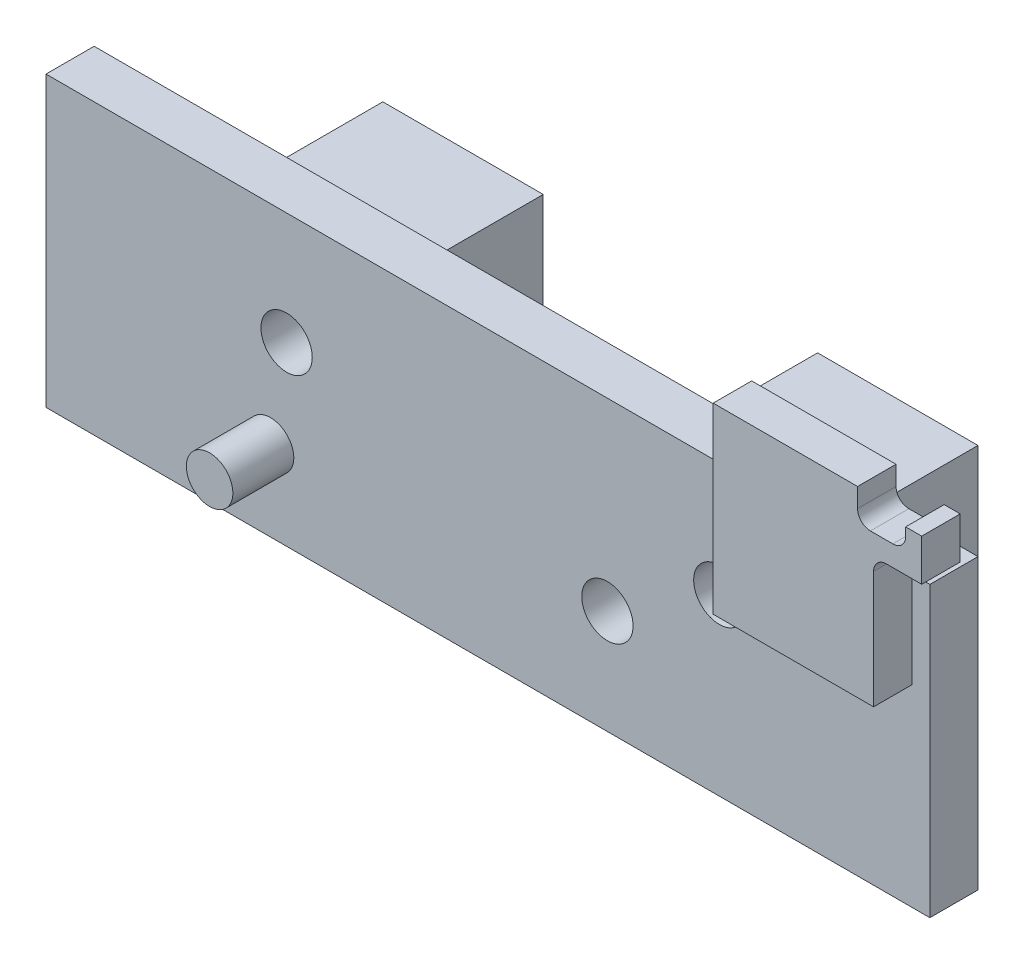
ISO-10303-21;
HEADER;
FILE_DESCRIPTION(('STEP AP214'),'2;1');
FILE_NAME('part.step','',(''),(''),'','','');
FILE_SCHEMA(('AUTOMOTIVE_DESIGN { 1 0 10303 214 1 1 1 1 }'));
ENDSEC;
DATA;
#1=APPLICATION_CONTEXT('core data for automotive mechanical design processes');
#2=APPLICATION_PROTOCOL_DEFINITION('international standard','automotive_design',2000,#1);
#3=PRODUCT_CONTEXT('',#1,'mechanical');
#4=PRODUCT('Part','Part','',(#3));
#5=PRODUCT_RELATED_PRODUCT_CATEGORY('part','',(#4));
#6=PRODUCT_DEFINITION_FORMATION('','',#4);
#7=PRODUCT_DEFINITION_CONTEXT('part definition',#1,'design');
#8=PRODUCT_DEFINITION('design','',#6,#7);
#9=PRODUCT_DEFINITION_SHAPE('','',#8);
#10=(LENGTH_UNIT() NAMED_UNIT(*) SI_UNIT(.MILLI.,.METRE.));
#11=(NAMED_UNIT(*) PLANE_ANGLE_UNIT() SI_UNIT($,.RADIAN.));
#12=(NAMED_UNIT(*) SI_UNIT($,.STERADIAN.) SOLID_ANGLE_UNIT());
#13=UNCERTAINTY_MEASURE_WITH_UNIT(LENGTH_MEASURE(1.E-05),#10,'distance_accuracy_value','');
#14=(GEOMETRIC_REPRESENTATION_CONTEXT(3) GLOBAL_UNCERTAINTY_ASSIGNED_CONTEXT((#13)) GLOBAL_UNIT_ASSIGNED_CONTEXT((#10,
#11,#12)) REPRESENTATION_CONTEXT('',''));
#15=CARTESIAN_POINT('',(0.,0.,0.));
#16=DIRECTION('',(0.,0.,1.));
#17=DIRECTION('',(1.,0.,0.));
#18=AXIS2_PLACEMENT_3D('',#15,#16,#17);
#19=CARTESIAN_POINT('',(3.89791416313169,11.2185679464598,-5.89679211209293));
#20=DIRECTION('',(1.,0.,0.));
#21=DIRECTION('',(0.,1.,0.));
#22=AXIS2_PLACEMENT_3D('',#19,#20,#21);
#23=PLANE('',#22);
#24=DIRECTION('',(0.,-1.,0.));
#25=VECTOR('',#24,1.);
#26=CARTESIAN_POINT('',(3.89791416313169,11.2185679464598,-7.09679211209293));
#27=LINE('',#26,#25);
#28=CARTESIAN_POINT('',(3.89791416313169,11.2185679464598,-7.09679211209293));
#29=VERTEX_POINT('',#28);
#30=CARTESIAN_POINT('',(3.89791416313169,5.51856794645976,-7.09679211209293));
#31=VERTEX_POINT('',#30);
#32=EDGE_CURVE('P0_E125',#29,#31,#27,.T.);
#33=ORIENTED_EDGE('',*,*,#32,.T.);
#34=DIRECTION('',(0.,0.,-1.));
#35=VECTOR('',#34,1.);
#36=CARTESIAN_POINT('',(3.89791416313169,5.51856794645976,-5.89679211209293));
#37=LINE('',#36,#35);
#38=CARTESIAN_POINT('',(3.89791416313169,5.51856794645976,-5.89679211209293));
#39=VERTEX_POINT('',#38);
#40=EDGE_CURVE('P0_E123',#39,#31,#37,.T.);
#41=ORIENTED_EDGE('',*,*,#40,.F.);
#42=DIRECTION('',(0.,-1.,0.));
#43=VECTOR('',#42,1.);
#44=CARTESIAN_POINT('',(3.89791416313169,11.2185679464598,-5.89679211209293));
#45=LINE('',#44,#43);
#46=CARTESIAN_POINT('',(3.89791416313169,11.2185679464598,-5.89679211209293));
#47=VERTEX_POINT('',#46);
#48=EDGE_CURVE('P0_E111',#47,#39,#45,.T.);
#49=ORIENTED_EDGE('',*,*,#48,.F.);
#50=DIRECTION('',(0.,0.,-1.));
#51=VECTOR('',#50,1.);
#52=CARTESIAN_POINT('',(3.89791416313169,11.2185679464598,-5.89679211209293));
#53=LINE('',#52,#51);
#54=EDGE_CURVE('P0_E156',#47,#29,#53,.T.);
#55=ORIENTED_EDGE('',*,*,#54,.T.);
#56=EDGE_LOOP('',(#33,#41,#49,#55));
#57=FACE_BOUND('',#56,.T.);
#58=ADVANCED_FACE('P0_F16',(#57),#23,.F.);
#59=CARTESIAN_POINT('',(8.89791416313169,5.51856794645976,-5.89679211209293));
#60=DIRECTION('',(0.,-1.,0.));
#61=DIRECTION('',(0.,0.,-1.));
#62=AXIS2_PLACEMENT_3D('',#59,#60,#61);
#63=PLANE('',#62);
#64=DIRECTION('',(-1.,0.,0.));
#65=VECTOR('',#64,1.);
#66=CARTESIAN_POINT('',(8.89791416313169,5.51856794645976,-7.09679211209293));
#67=LINE('',#66,#65);
#68=CARTESIAN_POINT('',(8.89791416313169,5.51856794645976,-7.09679211209293));
#69=VERTEX_POINT('',#68);
#70=EDGE_CURVE('P0_E158',#69,#31,#67,.T.);
#71=ORIENTED_EDGE('',*,*,#70,.F.);
#72=DIRECTION('',(0.,0.,-1.));
#73=VECTOR('',#72,1.);
#74=CARTESIAN_POINT('',(8.89791416313169,5.51856794645976,-5.89679211209293));
#75=LINE('',#74,#73);
#76=CARTESIAN_POINT('',(8.89791416313169,5.51856794645976,-5.89679211209293));
#77=VERTEX_POINT('',#76);
#78=EDGE_CURVE('P0_E130',#77,#69,#75,.T.);
#79=ORIENTED_EDGE('',*,*,#78,.F.);
#80=DIRECTION('',(-1.,0.,0.));
#81=VECTOR('',#80,1.);
#82=CARTESIAN_POINT('',(8.89791416313169,5.51856794645976,-5.89679211209293));
#83=LINE('',#82,#81);
#84=EDGE_CURVE('P0_E116',#77,#39,#83,.T.);
#85=ORIENTED_EDGE('',*,*,#84,.T.);
#86=ORIENTED_EDGE('',*,*,#40,.T.);
#87=EDGE_LOOP('',(#71,#79,#85,#86));
#88=FACE_BOUND('',#87,.T.);
#89=ADVANCED_FACE('P0_F133',(#88),#63,.T.);
#90=CARTESIAN_POINT('',(8.89791416313169,9.57802950131117,-5.89679211209293));
#91=DIRECTION('',(1.,0.,0.));
#92=DIRECTION('',(0.,1.,0.));
#93=AXIS2_PLACEMENT_3D('',#90,#91,#92);
#94=PLANE('',#93);
#95=DIRECTION('',(0.,-1.,0.));
#96=VECTOR('',#95,1.);
#97=CARTESIAN_POINT('',(8.89791416313169,9.57802950131117,-7.09679211209293));
#98=LINE('',#97,#96);
#99=CARTESIAN_POINT('',(8.89791416313169,9.17802950131117,-7.09679211209293));
#100=VERTEX_POINT('',#99);
#101=EDGE_CURVE('P0_E160',#100,#69,#98,.T.);
#102=ORIENTED_EDGE('',*,*,#101,.F.);
#103=DIRECTION('',(0.,0.,-1.));
#104=VECTOR('',#103,1.);
#105=CARTESIAN_POINT('',(8.89791416313169,9.17802950131117,-5.89679211209293));
#106=LINE('',#105,#104);
#107=CARTESIAN_POINT('',(8.89791416313169,9.17802950131117,-5.89679211209293));
#108=VERTEX_POINT('',#107);
#109=EDGE_CURVE('P0_E194',#100,#108,#106,.F.);
#110=ORIENTED_EDGE('',*,*,#109,.T.);
#111=DIRECTION('',(0.,-1.,0.));
#112=VECTOR('',#111,1.);
#113=CARTESIAN_POINT('',(8.89791416313169,9.57802950131117,-5.89679211209293));
#114=LINE('',#113,#112);
#115=EDGE_CURVE('P0_E135',#108,#77,#114,.T.);
#116=ORIENTED_EDGE('',*,*,#115,.T.);
#117=ORIENTED_EDGE('',*,*,#78,.T.);
#118=EDGE_LOOP('',(#102,#110,#116,#117));
#119=FACE_BOUND('',#118,.T.);
#120=ADVANCED_FACE('P0_F227',(#119),#94,.T.);
#121=CARTESIAN_POINT('',(10.3979141631317,9.57802950131117,-5.89679211209293));
#122=DIRECTION('',(0.,-1.,0.));
#123=DIRECTION('',(0.,0.,-1.));
#124=AXIS2_PLACEMENT_3D('',#121,#122,#123);
#125=PLANE('',#124);
#126=DIRECTION('',(-1.,0.,0.));
#127=VECTOR('',#126,1.);
#128=CARTESIAN_POINT('',(10.3979141631317,9.57802950131117,-5.89679211209293));
#129=LINE('',#128,#127);
#130=CARTESIAN_POINT('',(10.3979141631317,9.57802950131117,-5.89679211209293));
#131=VERTEX_POINT('',#130);
#132=CARTESIAN_POINT('',(9.29791416313169,9.57802950131117,-5.89679211209293));
#133=VERTEX_POINT('',#132);
#134=EDGE_CURVE('P0_E137',#131,#133,#129,.T.);
#135=ORIENTED_EDGE('',*,*,#134,.T.);
#136=DIRECTION('',(0.,0.,-1.));
#137=VECTOR('',#136,1.);
#138=CARTESIAN_POINT('',(9.29791416313169,9.57802950131117,-7.09679211209293));
#139=LINE('',#138,#137);
#140=CARTESIAN_POINT('',(9.29791416313169,9.57802950131117,-7.09679211209293));
#141=VERTEX_POINT('',#140);
#142=EDGE_CURVE('P0_E129',#133,#141,#139,.T.);
#143=ORIENTED_EDGE('',*,*,#142,.T.);
#144=DIRECTION('',(-1.,0.,0.));
#145=VECTOR('',#144,1.);
#146=CARTESIAN_POINT('',(10.3979141631317,9.57802950131117,-7.09679211209293));
#147=LINE('',#146,#145);
#148=CARTESIAN_POINT('',(10.3979141631317,9.57802950131117,-7.09679211209293));
#149=VERTEX_POINT('',#148);
#150=EDGE_CURVE('P0_E162',#149,#141,#147,.T.);
#151=ORIENTED_EDGE('',*,*,#150,.F.);
#152=DIRECTION('',(0.,0.,-1.));
#153=VECTOR('',#152,1.);
#154=CARTESIAN_POINT('',(10.3979141631317,9.57802950131117,-5.89679211209293));
#155=LINE('',#154,#153);
#156=EDGE_CURVE('P0_E189',#131,#149,#155,.T.);
#157=ORIENTED_EDGE('',*,*,#156,.F.);
#158=EDGE_LOOP('',(#135,#143,#151,#157));
#159=FACE_BOUND('',#158,.T.);
#160=ADVANCED_FACE('P0_F235',(#159),#125,.T.);
#161=CARTESIAN_POINT('',(10.3979141631317,10.8780295013112,-5.89679211209293));
#162=DIRECTION('',(1.,0.,0.));
#163=DIRECTION('',(0.,1.,0.));
#164=AXIS2_PLACEMENT_3D('',#161,#162,#163);
#165=PLANE('',#164);
#166=DIRECTION('',(0.,-1.,0.));
#167=VECTOR('',#166,1.);
#168=CARTESIAN_POINT('',(10.3979141631317,10.8780295013112,-7.09679211209293));
#169=LINE('',#168,#167);
#170=CARTESIAN_POINT('',(10.3979141631317,10.8780295013112,-7.09679211209293));
#171=VERTEX_POINT('',#170);
#172=EDGE_CURVE('P0_E165',#171,#149,#169,.T.);
#173=ORIENTED_EDGE('',*,*,#172,.F.);
#174=DIRECTION('',(0.,0.,-1.));
#175=VECTOR('',#174,1.);
#176=CARTESIAN_POINT('',(10.3979141631317,10.8780295013112,-5.89679211209293));
#177=LINE('',#176,#175);
#178=CARTESIAN_POINT('',(10.3979141631317,10.8780295013112,-5.89679211209293));
#179=VERTEX_POINT('',#178);
#180=EDGE_CURVE('P0_E187',#179,#171,#177,.T.);
#181=ORIENTED_EDGE('',*,*,#180,.F.);
#182=DIRECTION('',(0.,-1.,0.));
#183=VECTOR('',#182,1.);
#184=CARTESIAN_POINT('',(10.3979141631317,10.8780295013112,-5.89679211209293));
#185=LINE('',#184,#183);
#186=EDGE_CURVE('P0_E142',#179,#131,#185,.T.);
#187=ORIENTED_EDGE('',*,*,#186,.T.);
#188=ORIENTED_EDGE('',*,*,#156,.T.);
#189=EDGE_LOOP('',(#173,#181,#187,#188));
#190=FACE_BOUND('',#189,.T.);
#191=ADVANCED_FACE('P0_F239',(#190),#165,.T.);
#192=CARTESIAN_POINT('',(9.89791416313169,10.8780295013112,-5.89679211209293));
#193=DIRECTION('',(0.,1.,0.));
#194=DIRECTION('',(0.,0.,1.));
#195=AXIS2_PLACEMENT_3D('',#192,#193,#194);
#196=PLANE('',#195);
#197=DIRECTION('',(1.,0.,0.));
#198=VECTOR('',#197,1.);
#199=CARTESIAN_POINT('',(9.89791416313169,10.8780295013112,-7.09679211209293));
#200=LINE('',#199,#198);
#201=CARTESIAN_POINT('',(9.89791416313169,10.8780295013112,-7.09679211209293));
#202=VERTEX_POINT('',#201);
#203=EDGE_CURVE('P0_E168',#202,#171,#200,.T.);
#204=ORIENTED_EDGE('',*,*,#203,.F.);
#205=DIRECTION('',(0.,0.,-1.));
#206=VECTOR('',#205,1.);
#207=CARTESIAN_POINT('',(9.89791416313169,10.8780295013112,-5.89679211209293));
#208=LINE('',#207,#206);
#209=CARTESIAN_POINT('',(9.89791416313169,10.8780295013112,-5.89679211209293));
#210=VERTEX_POINT('',#209);
#211=EDGE_CURVE('P0_E184',#210,#202,#208,.T.);
#212=ORIENTED_EDGE('',*,*,#211,.F.);
#213=DIRECTION('',(1.,0.,0.));
#214=VECTOR('',#213,1.);
#215=CARTESIAN_POINT('',(9.89791416313169,10.8780295013112,-5.89679211209293));
#216=LINE('',#215,#214);
#217=EDGE_CURVE('P0_E145',#210,#179,#216,.T.);
#218=ORIENTED_EDGE('',*,*,#217,.T.);
#219=ORIENTED_EDGE('',*,*,#180,.T.);
#220=EDGE_LOOP('',(#204,#212,#218,#219));
#221=FACE_BOUND('',#220,.T.);
#222=ADVANCED_FACE('P0_F245',(#221),#196,.T.);
#223=CARTESIAN_POINT('',(9.89791416313169,10.2185679464598,-5.89679211209293));
#224=DIRECTION('',(-1.,0.,0.));
#225=DIRECTION('',(0.,0.,1.));
#226=AXIS2_PLACEMENT_3D('',#223,#224,#225);
#227=PLANE('',#226);
#228=DIRECTION('',(0.,1.,0.));
#229=VECTOR('',#228,1.);
#230=CARTESIAN_POINT('',(9.89791416313169,10.2185679464598,-7.09679211209293));
#231=LINE('',#230,#229);
#232=CARTESIAN_POINT('',(9.89791416313169,10.6185679464598,-7.09679211209293));
#233=VERTEX_POINT('',#232);
#234=EDGE_CURVE('P0_E171',#233,#202,#231,.T.);
#235=ORIENTED_EDGE('',*,*,#234,.F.);
#236=DIRECTION('',(0.,0.,-1.));
#237=VECTOR('',#236,1.);
#238=CARTESIAN_POINT('',(9.89791416313169,10.6185679464598,-5.89679211209293));
#239=LINE('',#238,#237);
#240=CARTESIAN_POINT('',(9.89791416313169,10.6185679464598,-5.89679211209293));
#241=VERTEX_POINT('',#240);
#242=EDGE_CURVE('P0_E201',#233,#241,#239,.F.);
#243=ORIENTED_EDGE('',*,*,#242,.T.);
#244=DIRECTION('',(0.,1.,0.));
#245=VECTOR('',#244,1.);
#246=CARTESIAN_POINT('',(9.89791416313169,10.2185679464598,-5.89679211209293));
#247=LINE('',#246,#245);
#248=EDGE_CURVE('P0_E148',#241,#210,#247,.T.);
#249=ORIENTED_EDGE('',*,*,#248,.T.);
#250=ORIENTED_EDGE('',*,*,#211,.T.);
#251=EDGE_LOOP('',(#235,#243,#249,#250));
#252=FACE_BOUND('',#251,.T.);
#253=ADVANCED_FACE('P0_F248',(#252),#227,.T.);
#254=CARTESIAN_POINT('',(8.39791416313169,10.2185679464598,-5.89679211209293));
#255=DIRECTION('',(0.,1.,0.));
#256=DIRECTION('',(0.,0.,1.));
#257=AXIS2_PLACEMENT_3D('',#254,#255,#256);
#258=PLANE('',#257);
#259=DIRECTION('',(1.,0.,0.));
#260=VECTOR('',#259,1.);
#261=CARTESIAN_POINT('',(8.39791416313169,10.2185679464598,-5.89679211209293));
#262=LINE('',#261,#260);
#263=CARTESIAN_POINT('',(8.79791416313169,10.2185679464598,-5.89679211209293));
#264=VERTEX_POINT('',#263);
#265=CARTESIAN_POINT('',(9.49791416313169,10.2185679464598,-5.89679211209293));
#266=VERTEX_POINT('',#265);
#267=EDGE_CURVE('P0_E150',#264,#266,#262,.T.);
#268=ORIENTED_EDGE('',*,*,#267,.T.);
#269=DIRECTION('',(0.,0.,-1.));
#270=VECTOR('',#269,1.);
#271=CARTESIAN_POINT('',(9.49791416313169,10.2185679464598,-7.09679211209293));
#272=LINE('',#271,#270);
#273=CARTESIAN_POINT('',(9.49791416313169,10.2185679464598,-7.09679211209293));
#274=VERTEX_POINT('',#273);
#275=EDGE_CURVE('P0_E198',#266,#274,#272,.T.);
#276=ORIENTED_EDGE('',*,*,#275,.T.);
#277=DIRECTION('',(1.,0.,0.));
#278=VECTOR('',#277,1.);
#279=CARTESIAN_POINT('',(8.39791416313169,10.2185679464598,-7.09679211209293));
#280=LINE('',#279,#278);
#281=CARTESIAN_POINT('',(8.79791416313169,10.2185679464598,-7.09679211209293));
#282=VERTEX_POINT('',#281);
#283=EDGE_CURVE('P0_E173',#282,#274,#280,.T.);
#284=ORIENTED_EDGE('',*,*,#283,.F.);
#285=DIRECTION('',(0.,0.,-1.));
#286=VECTOR('',#285,1.);
#287=CARTESIAN_POINT('',(8.79791416313169,10.2185679464598,-5.89679211209293));
#288=LINE('',#287,#286);
#289=EDGE_CURVE('P0_E196',#282,#264,#288,.F.);
#290=ORIENTED_EDGE('',*,*,#289,.T.);
#291=EDGE_LOOP('',(#268,#276,#284,#290));
#292=FACE_BOUND('',#291,.T.);
#293=ADVANCED_FACE('P0_F217',(#292),#258,.T.);
#294=CARTESIAN_POINT('',(8.39791416313169,11.2185679464598,-5.89679211209293));
#295=DIRECTION('',(1.,0.,0.));
#296=DIRECTION('',(0.,1.,0.));
#297=AXIS2_PLACEMENT_3D('',#294,#295,#296);
#298=PLANE('',#297);
#299=DIRECTION('',(0.,-1.,0.));
#300=VECTOR('',#299,1.);
#301=CARTESIAN_POINT('',(8.39791416313169,11.2185679464598,-5.89679211209293));
#302=LINE('',#301,#300);
#303=CARTESIAN_POINT('',(8.39791416313169,11.2185679464598,-5.89679211209293));
#304=VERTEX_POINT('',#303);
#305=CARTESIAN_POINT('',(8.39791416313169,10.6185679464598,-5.89679211209293));
#306=VERTEX_POINT('',#305);
#307=EDGE_CURVE('P0_E153',#304,#306,#302,.T.);
#308=ORIENTED_EDGE('',*,*,#307,.T.);
#309=DIRECTION('',(0.,0.,-1.));
#310=VECTOR('',#309,1.);
#311=CARTESIAN_POINT('',(8.39791416313169,10.6185679464598,-7.09679211209293));
#312=LINE('',#311,#310);
#313=CARTESIAN_POINT('',(8.39791416313169,10.6185679464598,-7.09679211209293));
#314=VERTEX_POINT('',#313);
#315=EDGE_CURVE('P0_E203',#306,#314,#312,.T.);
#316=ORIENTED_EDGE('',*,*,#315,.T.);
#317=DIRECTION('',(0.,-1.,0.));
#318=VECTOR('',#317,1.);
#319=CARTESIAN_POINT('',(8.39791416313169,11.2185679464598,-7.09679211209293));
#320=LINE('',#319,#318);
#321=CARTESIAN_POINT('',(8.39791416313169,11.2185679464598,-7.09679211209293));
#322=VERTEX_POINT('',#321);
#323=EDGE_CURVE('P0_E176',#322,#314,#320,.T.);
#324=ORIENTED_EDGE('',*,*,#323,.F.);
#325=DIRECTION('',(0.,0.,-1.));
#326=VECTOR('',#325,1.);
#327=CARTESIAN_POINT('',(8.39791416313169,11.2185679464598,-5.89679211209293));
#328=LINE('',#327,#326);
#329=EDGE_CURVE('P0_E182',#304,#322,#328,.T.);
#330=ORIENTED_EDGE('',*,*,#329,.F.);
#331=EDGE_LOOP('',(#308,#316,#324,#330));
#332=FACE_BOUND('',#331,.T.);
#333=ADVANCED_FACE('P0_F220',(#332),#298,.T.);
#334=CARTESIAN_POINT('',(3.89791416313169,11.2185679464598,-5.89679211209293));
#335=DIRECTION('',(0.,1.,0.));
#336=DIRECTION('',(0.,0.,1.));
#337=AXIS2_PLACEMENT_3D('',#334,#335,#336);
#338=PLANE('',#337);
#339=DIRECTION('',(1.,0.,0.));
#340=VECTOR('',#339,1.);
#341=CARTESIAN_POINT('',(3.89791416313169,11.2185679464598,-7.09679211209293));
#342=LINE('',#341,#340);
#343=EDGE_CURVE('P0_E120',#29,#322,#342,.T.);
#344=ORIENTED_EDGE('',*,*,#343,.F.);
#345=ORIENTED_EDGE('',*,*,#54,.F.);
#346=DIRECTION('',(1.,0.,0.));
#347=VECTOR('',#346,1.);
#348=CARTESIAN_POINT('',(3.89791416313169,11.2185679464598,-5.89679211209293));
#349=LINE('',#348,#347);
#350=EDGE_CURVE('P0_E118',#47,#304,#349,.T.);
#351=ORIENTED_EDGE('',*,*,#350,.T.);
#352=ORIENTED_EDGE('',*,*,#329,.T.);
#353=EDGE_LOOP('',(#344,#345,#351,#352));
#354=FACE_BOUND('',#353,.T.);
#355=ADVANCED_FACE('P0_F223',(#354),#338,.T.);
#356=CARTESIAN_POINT('',(-0.321338671413671,0.718567946459769,-5.89679211209293));
#357=DIRECTION('',(0.,0.,-1.));
#358=DIRECTION('',(-1.,0.,0.));
#359=AXIS2_PLACEMENT_3D('',#356,#357,#358);
#360=PLANE('',#359);
#361=ORIENTED_EDGE('',*,*,#48,.T.);
#362=ORIENTED_EDGE('',*,*,#84,.F.);
#363=ORIENTED_EDGE('',*,*,#115,.F.);
#364=CARTESIAN_POINT('',(9.29791416313169,9.17802950131117,-5.89679211209293));
#365=DIRECTION('',(0.,0.,-1.));
#366=DIRECTION('',(-1.,0.,0.));
#367=AXIS2_PLACEMENT_3D('',#364,#365,#366);
#368=CIRCLE('',#367,0.4);
#369=EDGE_CURVE('P0_E207',#108,#133,#368,.T.);
#370=ORIENTED_EDGE('',*,*,#369,.T.);
#371=ORIENTED_EDGE('',*,*,#134,.F.);
#372=ORIENTED_EDGE('',*,*,#186,.F.);
#373=ORIENTED_EDGE('',*,*,#217,.F.);
#374=ORIENTED_EDGE('',*,*,#248,.F.);
#375=CARTESIAN_POINT('',(9.49791416313169,10.6185679464598,-5.89679211209293));
#376=DIRECTION('',(0.,0.,-1.));
#377=DIRECTION('',(-1.,0.,0.));
#378=AXIS2_PLACEMENT_3D('',#375,#376,#377);
#379=CIRCLE('',#378,0.4);
#380=EDGE_CURVE('P0_E211',#241,#266,#379,.T.);
#381=ORIENTED_EDGE('',*,*,#380,.T.);
#382=ORIENTED_EDGE('',*,*,#267,.F.);
#383=CARTESIAN_POINT('',(8.79791416313169,10.6185679464598,-5.89679211209293));
#384=DIRECTION('',(0.,0.,-1.));
#385=DIRECTION('',(-1.,0.,0.));
#386=AXIS2_PLACEMENT_3D('',#383,#384,#385);
#387=CIRCLE('',#386,0.4);
#388=EDGE_CURVE('P0_E11',#264,#306,#387,.T.);
#389=ORIENTED_EDGE('',*,*,#388,.T.);
#390=ORIENTED_EDGE('',*,*,#307,.F.);
#391=ORIENTED_EDGE('',*,*,#350,.F.);
#392=EDGE_LOOP('',(#361,#362,#363,#370,#371,#372,#373,#374,#381,#382,#389,#390,#391));
#393=FACE_BOUND('',#392,.T.);
#394=ADVANCED_FACE('P0_F113',(#393),#360,.F.);
#395=CARTESIAN_POINT('',(-0.321338671413671,0.718567946459769,-7.09679211209293));
#396=DIRECTION('',(0.,0.,-1.));
#397=DIRECTION('',(-1.,0.,0.));
#398=AXIS2_PLACEMENT_3D('',#395,#396,#397);
#399=PLANE('',#398);
#400=ORIENTED_EDGE('',*,*,#32,.F.);
#401=ORIENTED_EDGE('',*,*,#343,.T.);
#402=ORIENTED_EDGE('',*,*,#323,.T.);
#403=CARTESIAN_POINT('',(8.79791416313169,10.6185679464598,-7.09679211209293));
#404=DIRECTION('',(0.,0.,-1.));
#405=DIRECTION('',(-1.,0.,0.));
#406=AXIS2_PLACEMENT_3D('',#403,#404,#405);
#407=CIRCLE('',#406,0.4);
#408=EDGE_CURVE('P0_E24',#314,#282,#407,.F.);
#409=ORIENTED_EDGE('',*,*,#408,.T.);
#410=ORIENTED_EDGE('',*,*,#283,.T.);
#411=CARTESIAN_POINT('',(9.49791416313169,10.6185679464598,-7.09679211209293));
#412=DIRECTION('',(0.,0.,-1.));
#413=DIRECTION('',(-1.,0.,0.));
#414=AXIS2_PLACEMENT_3D('',#411,#412,#413);
#415=CIRCLE('',#414,0.4);
#416=EDGE_CURVE('P0_E209',#274,#233,#415,.F.);
#417=ORIENTED_EDGE('',*,*,#416,.T.);
#418=ORIENTED_EDGE('',*,*,#234,.T.);
#419=ORIENTED_EDGE('',*,*,#203,.T.);
#420=ORIENTED_EDGE('',*,*,#172,.T.);
#421=ORIENTED_EDGE('',*,*,#150,.T.);
#422=CARTESIAN_POINT('',(9.29791416313169,9.17802950131117,-7.09679211209293));
#423=DIRECTION('',(0.,0.,-1.));
#424=DIRECTION('',(-1.,0.,0.));
#425=AXIS2_PLACEMENT_3D('',#422,#423,#424);
#426=CIRCLE('',#425,0.4);
#427=EDGE_CURVE('P0_E205',#141,#100,#426,.F.);
#428=ORIENTED_EDGE('',*,*,#427,.T.);
#429=ORIENTED_EDGE('',*,*,#101,.T.);
#430=ORIENTED_EDGE('',*,*,#70,.T.);
#431=EDGE_LOOP('',(#400,#401,#402,#409,#410,#417,#418,#419,#420,#421,#428,#429,#430));
#432=FACE_BOUND('',#431,.T.);
#433=ADVANCED_FACE('P0_F214',(#432),#399,.T.);
#434=CARTESIAN_POINT('',(9.29791416313169,9.17802950131117,-5.89679211209293));
#435=DIRECTION('',(0.,0.,1.));
#436=DIRECTION('',(1.,0.,0.));
#437=AXIS2_PLACEMENT_3D('',#434,#435,#436);
#438=CYLINDRICAL_SURFACE('',#437,0.4);
#439=ORIENTED_EDGE('',*,*,#369,.F.);
#440=ORIENTED_EDGE('',*,*,#109,.F.);
#441=ORIENTED_EDGE('',*,*,#427,.F.);
#442=ORIENTED_EDGE('',*,*,#142,.F.);
#443=EDGE_LOOP('',(#439,#440,#441,#442));
#444=FACE_BOUND('',#443,.T.);
#445=ADVANCED_FACE('P0_F232',(#444),#438,.F.);
#446=CARTESIAN_POINT('',(9.49791416313169,10.6185679464598,-5.89679211209293));
#447=DIRECTION('',(0.,0.,1.));
#448=DIRECTION('',(1.,0.,0.));
#449=AXIS2_PLACEMENT_3D('',#446,#447,#448);
#450=CYLINDRICAL_SURFACE('',#449,0.4);
#451=ORIENTED_EDGE('',*,*,#380,.F.);
#452=ORIENTED_EDGE('',*,*,#242,.F.);
#453=ORIENTED_EDGE('',*,*,#416,.F.);
#454=ORIENTED_EDGE('',*,*,#275,.F.);
#455=EDGE_LOOP('',(#451,#452,#453,#454));
#456=FACE_BOUND('',#455,.T.);
#457=ADVANCED_FACE('P0_F252',(#456),#450,.F.);
#458=CARTESIAN_POINT('',(8.79791416313169,10.6185679464598,-5.89679211209293));
#459=DIRECTION('',(0.,0.,1.));
#460=DIRECTION('',(1.,0.,0.));
#461=AXIS2_PLACEMENT_3D('',#458,#459,#460);
#462=CYLINDRICAL_SURFACE('',#461,0.4);
#463=ORIENTED_EDGE('',*,*,#388,.F.);
#464=ORIENTED_EDGE('',*,*,#289,.F.);
#465=ORIENTED_EDGE('',*,*,#408,.F.);
#466=ORIENTED_EDGE('',*,*,#315,.F.);
#467=EDGE_LOOP('',(#463,#464,#465,#466));
#468=FACE_BOUND('',#467,.T.);
#469=ADVANCED_FACE('P0_F18',(#468),#462,.F.);
#470=CLOSED_SHELL('',(#58,#89,#120,#160,#191,#222,#253,#293,#333,#355,#394,#433,#445,#457,#469));
#471=MANIFOLD_SOLID_BREP('P0_B1',#470);
#472=CARTESIAN_POINT('',(0.,-1.29679211209286,-12.5967921120929));
#473=DIRECTION('',(0.,0.,1.));
#474=DIRECTION('',(1.,0.,0.));
#475=AXIS2_PLACEMENT_3D('',#472,#473,#474);
#476=PLANE('',#475);
#477=DIRECTION('',(-1.,0.,0.));
#478=VECTOR('',#477,1.);
#479=CARTESIAN_POINT('',(-8.1,2.50320788790714,-12.5967921120929));
#480=LINE('',#479,#478);
#481=CARTESIAN_POINT('',(-8.1,2.50320788790714,-12.5967921120929));
#482=VERTEX_POINT('',#481);
#483=CARTESIAN_POINT('',(-13.1,2.50320788790714,-12.5967921120929));
#484=VERTEX_POINT('',#483);
#485=EDGE_CURVE('P1_E106',#482,#484,#480,.T.);
#486=ORIENTED_EDGE('',*,*,#485,.T.);
#487=DIRECTION('',(0.,-1.,0.));
#488=VECTOR('',#487,1.);
#489=CARTESIAN_POINT('',(-13.1,7.50320788790714,-12.5967921120929));
#490=LINE('',#489,#488);
#491=CARTESIAN_POINT('',(-13.1,7.50320788790714,-12.5967921120929));
#492=VERTEX_POINT('',#491);
#493=EDGE_CURVE('P1_E111',#492,#484,#490,.T.);
#494=ORIENTED_EDGE('',*,*,#493,.F.);
#495=DIRECTION('',(-1.,0.,0.));
#496=VECTOR('',#495,1.);
#497=CARTESIAN_POINT('',(-8.1,7.50320788790714,-12.5967921120929));
#498=LINE('',#497,#496);
#499=CARTESIAN_POINT('',(-8.1,7.50320788790714,-12.5967921120929));
#500=VERTEX_POINT('',#499);
#501=EDGE_CURVE('P1_E130',#500,#492,#498,.T.);
#502=ORIENTED_EDGE('',*,*,#501,.F.);
#503=DIRECTION('',(0.,1.,0.));
#504=VECTOR('',#503,1.);
#505=CARTESIAN_POINT('',(-8.1,2.50320788790714,-12.5967921120929));
#506=LINE('',#505,#504);
#507=EDGE_CURVE('P1_E114',#482,#500,#506,.T.);
#508=ORIENTED_EDGE('',*,*,#507,.F.);
#509=EDGE_LOOP('',(#486,#494,#502,#508));
#510=FACE_BOUND('',#509,.T.);
#511=CARTESIAN_POINT('',(-10.6,5.00320788790714,-12.5967921120929));
#512=DIRECTION('',(0.,0.,-1.));
#513=DIRECTION('',(-1.,0.,0.));
#514=AXIS2_PLACEMENT_3D('',#511,#512,#513);
#515=CIRCLE('',#514,0.799999999999988);
#516=CARTESIAN_POINT('',(-11.4,5.00320788790714,-12.5967921120929));
#517=VERTEX_POINT('',#516);
#518=EDGE_CURVE('P1_E311',#517,#517,#515,.T.);
#519=ORIENTED_EDGE('',*,*,#518,.F.);
#520=EDGE_LOOP('',(#519));
#521=FACE_BOUND('',#520,.T.);
#522=ADVANCED_FACE('P1_F15',(#510,#521),#476,.F.);
#523=CARTESIAN_POINT('',(0.,-1.29679211209288,-8.59679211209294));
#524=DIRECTION('',(0.,0.,1.));
#525=DIRECTION('',(1.,0.,0.));
#526=AXIS2_PLACEMENT_3D('',#523,#524,#525);
#527=PLANE('',#526);
#528=DIRECTION('',(-1.,0.,0.));
#529=VECTOR('',#528,1.);
#530=CARTESIAN_POINT('',(5.45255241381915,2.50320788790712,-8.59679211209292));
#531=LINE('',#530,#529);
#532=CARTESIAN_POINT('',(5.45255241381915,2.50320788790712,-8.59679211209292));
#533=VERTEX_POINT('',#532);
#534=CARTESIAN_POINT('',(0.452552413819151,2.50320788790712,-8.59679211209292));
#535=VERTEX_POINT('',#534);
#536=EDGE_CURVE('P1_E126',#533,#535,#531,.T.);
#537=ORIENTED_EDGE('',*,*,#536,.F.);
#538=DIRECTION('',(0.,1.,0.));
#539=VECTOR('',#538,1.);
#540=CARTESIAN_POINT('',(5.45255241381915,2.50320788790712,-8.59679211209292));
#541=LINE('',#540,#539);
#542=CARTESIAN_POINT('',(5.45255241381915,7.50320788790712,-8.59679211209291));
#543=VERTEX_POINT('',#542);
#544=EDGE_CURVE('P1_E151',#533,#543,#541,.T.);
#545=ORIENTED_EDGE('',*,*,#544,.T.);
#546=DIRECTION('',(-1.,0.,0.));
#547=VECTOR('',#546,1.);
#548=CARTESIAN_POINT('',(5.45255241381915,7.50320788790712,-8.59679211209291));
#549=LINE('',#548,#547);
#550=CARTESIAN_POINT('',(0.452552413819151,7.50320788790712,-8.59679211209291));
#551=VERTEX_POINT('',#550);
#552=EDGE_CURVE('P1_E40',#543,#551,#549,.T.);
#553=ORIENTED_EDGE('',*,*,#552,.T.);
#554=DIRECTION('',(0.,-1.,0.));
#555=VECTOR('',#554,1.);
#556=CARTESIAN_POINT('',(0.452552413819151,7.50320788790712,-8.59679211209291));
#557=LINE('',#556,#555);
#558=EDGE_CURVE('P1_E163',#551,#535,#557,.T.);
#559=ORIENTED_EDGE('',*,*,#558,.T.);
#560=EDGE_LOOP('',(#537,#545,#553,#559));
#561=FACE_BOUND('',#560,.T.);
#562=CARTESIAN_POINT('',(-0.599999999999999,2.75320788790712,-8.59679211209292));
#563=DIRECTION('',(0.,0.,1.));
#564=DIRECTION('',(1.,0.,0.));
#565=AXIS2_PLACEMENT_3D('',#562,#563,#564);
#566=CIRCLE('',#565,0.799999999999999);
#567=CARTESIAN_POINT('',(0.2,2.75320788790712,-8.59679211209292));
#568=VERTEX_POINT('',#567);
#569=EDGE_CURVE('P1_E179',#568,#568,#566,.T.);
#570=ORIENTED_EDGE('',*,*,#569,.T.);
#571=EDGE_LOOP('',(#570));
#572=FACE_BOUND('',#571,.T.);
#573=DIRECTION('',(0.,1.,0.));
#574=VECTOR('',#573,1.);
#575=CARTESIAN_POINT('',(9.45255241381915,-0.496792112092878,-8.59679211209293));
#576=LINE('',#575,#574);
#577=CARTESIAN_POINT('',(9.45255241381915,-0.496792112092878,-8.59679211209293));
#578=VERTEX_POINT('',#577);
#579=CARTESIAN_POINT('',(9.45255241381915,8.50320788790712,-8.5967921120929));
#580=VERTEX_POINT('',#579);
#581=EDGE_CURVE('P1_E189',#578,#580,#576,.T.);
#582=ORIENTED_EDGE('',*,*,#581,.F.);
#583=DIRECTION('',(1.,0.,0.));
#584=VECTOR('',#583,1.);
#585=CARTESIAN_POINT('',(-18.1,-0.496792112092878,-8.59679211209294));
#586=LINE('',#585,#584);
#587=CARTESIAN_POINT('',(-18.1,-0.496792112092878,-8.59679211209294));
#588=VERTEX_POINT('',#587);
#589=EDGE_CURVE('P1_E199',#588,#578,#586,.T.);
#590=ORIENTED_EDGE('',*,*,#589,.F.);
#591=DIRECTION('',(0.,-1.,0.));
#592=VECTOR('',#591,1.);
#593=CARTESIAN_POINT('',(-18.1,8.50320788790712,-8.59679211209291));
#594=LINE('',#593,#592);
#595=CARTESIAN_POINT('',(-18.1,8.50320788790712,-8.59679211209291));
#596=VERTEX_POINT('',#595);
#597=EDGE_CURVE('P1_E196',#596,#588,#594,.T.);
#598=ORIENTED_EDGE('',*,*,#597,.F.);
#599=DIRECTION('',(-1.,0.,0.));
#600=VECTOR('',#599,1.);
#601=CARTESIAN_POINT('',(9.45255241381915,8.50320788790712,-8.5967921120929));
#602=LINE('',#601,#600);
#603=EDGE_CURVE('P1_E192',#580,#596,#602,.T.);
#604=ORIENTED_EDGE('',*,*,#603,.F.);
#605=EDGE_LOOP('',(#582,#590,#598,#604));
#606=FACE_BOUND('',#605,.T.);
#607=DIRECTION('',(-1.,0.,0.));
#608=VECTOR('',#607,1.);
#609=CARTESIAN_POINT('',(-8.1,2.50320788790712,-8.59679211209293));
#610=LINE('',#609,#608);
#611=CARTESIAN_POINT('',(-8.1,2.50320788790712,-8.59679211209293));
#612=VERTEX_POINT('',#611);
#613=CARTESIAN_POINT('',(-13.1,2.50320788790712,-8.59679211209293));
#614=VERTEX_POINT('',#613);
#615=EDGE_CURVE('P1_E122',#612,#614,#610,.T.);
#616=ORIENTED_EDGE('',*,*,#615,.F.);
#617=DIRECTION('',(0.,1.,0.));
#618=VECTOR('',#617,1.);
#619=CARTESIAN_POINT('',(-8.1,2.50320788790712,-8.59679211209293));
#620=LINE('',#619,#618);
#621=CARTESIAN_POINT('',(-8.1,7.50320788790712,-8.59679211209291));
#622=VERTEX_POINT('',#621);
#623=EDGE_CURVE('P1_E116',#612,#622,#620,.T.);
#624=ORIENTED_EDGE('',*,*,#623,.T.);
#625=DIRECTION('',(-1.,0.,0.));
#626=VECTOR('',#625,1.);
#627=CARTESIAN_POINT('',(-8.1,7.50320788790712,-8.59679211209291));
#628=LINE('',#627,#626);
#629=CARTESIAN_POINT('',(-13.1,7.50320788790712,-8.59679211209291));
#630=VERTEX_POINT('',#629);
#631=EDGE_CURVE('P1_E32',#622,#630,#628,.T.);
#632=ORIENTED_EDGE('',*,*,#631,.T.);
#633=DIRECTION('',(0.,-1.,0.));
#634=VECTOR('',#633,1.);
#635=CARTESIAN_POINT('',(-13.1,7.50320788790712,-8.59679211209291));
#636=LINE('',#635,#634);
#637=EDGE_CURVE('P1_E138',#630,#614,#636,.T.);
#638=ORIENTED_EDGE('',*,*,#637,.T.);
#639=EDGE_LOOP('',(#616,#624,#632,#638));
#640=FACE_BOUND('',#639,.T.);
#641=ADVANCED_FACE('P1_F228',(#561,#572,#606,#640),#527,.F.);
#642=CARTESIAN_POINT('',(9.45255241381915,-0.496792112092878,-8.59679211209293));
#643=DIRECTION('',(1.,0.,0.));
#644=DIRECTION('',(0.,0.,-1.));
#645=AXIS2_PLACEMENT_3D('',#642,#643,#644);
#646=PLANE('',#645);
#647=DIRECTION('',(0.,1.,0.));
#648=VECTOR('',#647,1.);
#649=CARTESIAN_POINT('',(9.45255241381915,-0.496792112092883,-7.09679211209293));
#650=LINE('',#649,#648);
#651=CARTESIAN_POINT('',(9.45255241381915,-0.496792112092883,-7.09679211209293));
#652=VERTEX_POINT('',#651);
#653=CARTESIAN_POINT('',(9.45255241381915,8.50320788790712,-7.0967921120929));
#654=VERTEX_POINT('',#653);
#655=EDGE_CURVE('P1_E188',#652,#654,#650,.T.);
#656=ORIENTED_EDGE('',*,*,#655,.F.);
#657=DIRECTION('',(0.,0.,1.));
#658=VECTOR('',#657,1.);
#659=CARTESIAN_POINT('',(9.45255241381915,-0.496792112092878,-8.59679211209293));
#660=LINE('',#659,#658);
#661=EDGE_CURVE('P1_E10',#578,#652,#660,.T.);
#662=ORIENTED_EDGE('',*,*,#661,.F.);
#663=ORIENTED_EDGE('',*,*,#581,.T.);
#664=DIRECTION('',(0.,0.,1.));
#665=VECTOR('',#664,1.);
#666=CARTESIAN_POINT('',(9.45255241381915,8.50320788790712,-8.5967921120929));
#667=LINE('',#666,#665);
#668=EDGE_CURVE('P1_E19',#580,#654,#667,.T.);
#669=ORIENTED_EDGE('',*,*,#668,.T.);
#670=EDGE_LOOP('',(#656,#662,#663,#669));
#671=FACE_BOUND('',#670,.T.);
#672=ADVANCED_FACE('P1_F17',(#671),#646,.T.);
#673=CARTESIAN_POINT('',(-18.1,-0.496792112092878,-8.59679211209294));
#674=DIRECTION('',(0.,-1.,0.));
#675=DIRECTION('',(0.,0.,1.));
#676=AXIS2_PLACEMENT_3D('',#673,#674,#675);
#677=PLANE('',#676);
#678=DIRECTION('',(1.,0.,0.));
#679=VECTOR('',#678,1.);
#680=CARTESIAN_POINT('',(-18.1,-0.496792112092883,-7.09679211209294));
#681=LINE('',#680,#679);
#682=CARTESIAN_POINT('',(-18.1,-0.496792112092883,-7.09679211209294));
#683=VERTEX_POINT('',#682);
#684=EDGE_CURVE('P1_E193',#683,#652,#681,.T.);
#685=ORIENTED_EDGE('',*,*,#684,.F.);
#686=DIRECTION('',(0.,0.,1.));
#687=VECTOR('',#686,1.);
#688=CARTESIAN_POINT('',(-18.1,-0.496792112092878,-8.59679211209294));
#689=LINE('',#688,#687);
#690=EDGE_CURVE('P1_E24',#588,#683,#689,.T.);
#691=ORIENTED_EDGE('',*,*,#690,.F.);
#692=ORIENTED_EDGE('',*,*,#589,.T.);
#693=ORIENTED_EDGE('',*,*,#661,.T.);
#694=EDGE_LOOP('',(#685,#691,#692,#693));
#695=FACE_BOUND('',#694,.T.);
#696=ADVANCED_FACE('P1_F225',(#695),#677,.T.);
#697=CARTESIAN_POINT('',(-18.1,8.50320788790712,-8.59679211209291));
#698=DIRECTION('',(-1.,0.,0.));
#699=DIRECTION('',(0.,0.,1.));
#700=AXIS2_PLACEMENT_3D('',#697,#698,#699);
#701=PLANE('',#700);
#702=DIRECTION('',(0.,-1.,0.));
#703=VECTOR('',#702,1.);
#704=CARTESIAN_POINT('',(-18.1,8.50320788790711,-7.09679211209291));
#705=LINE('',#704,#703);
#706=CARTESIAN_POINT('',(-18.1,8.50320788790711,-7.09679211209291));
#707=VERTEX_POINT('',#706);
#708=EDGE_CURVE('P1_E207',#707,#683,#705,.T.);
#709=ORIENTED_EDGE('',*,*,#708,.F.);
#710=DIRECTION('',(0.,0.,1.));
#711=VECTOR('',#710,1.);
#712=CARTESIAN_POINT('',(-18.1,8.50320788790712,-8.59679211209291));
#713=LINE('',#712,#711);
#714=EDGE_CURVE('P1_E212',#596,#707,#713,.T.);
#715=ORIENTED_EDGE('',*,*,#714,.F.);
#716=ORIENTED_EDGE('',*,*,#597,.T.);
#717=ORIENTED_EDGE('',*,*,#690,.T.);
#718=EDGE_LOOP('',(#709,#715,#716,#717));
#719=FACE_BOUND('',#718,.T.);
#720=ADVANCED_FACE('P1_F232',(#719),#701,.T.);
#721=CARTESIAN_POINT('',(9.45255241381915,8.50320788790712,-8.5967921120929));
#722=DIRECTION('',(0.,1.,0.));
#723=DIRECTION('',(1.,0.,0.));
#724=AXIS2_PLACEMENT_3D('',#721,#722,#723);
#725=PLANE('',#724);
#726=DIRECTION('',(-1.,0.,0.));
#727=VECTOR('',#726,1.);
#728=CARTESIAN_POINT('',(9.45255241381915,8.50320788790712,-7.0967921120929));
#729=LINE('',#728,#727);
#730=EDGE_CURVE('P1_E204',#654,#707,#729,.T.);
#731=ORIENTED_EDGE('',*,*,#730,.F.);
#732=ORIENTED_EDGE('',*,*,#668,.F.);
#733=ORIENTED_EDGE('',*,*,#603,.T.);
#734=ORIENTED_EDGE('',*,*,#714,.T.);
#735=EDGE_LOOP('',(#731,#732,#733,#734));
#736=FACE_BOUND('',#735,.T.);
#737=ADVANCED_FACE('P1_F220',(#736),#725,.T.);
#738=CARTESIAN_POINT('',(0.,-1.29679211209288,-7.09679211209294));
#739=DIRECTION('',(0.,0.,1.));
#740=DIRECTION('',(1.,0.,0.));
#741=AXIS2_PLACEMENT_3D('',#738,#739,#740);
#742=PLANE('',#741);
#743=CARTESIAN_POINT('',(2.88898874217055,4.93964421625851,-7.09679211209292));
#744=DIRECTION('',(0.,0.,1.));
#745=DIRECTION('',(1.,0.,0.));
#746=AXIS2_PLACEMENT_3D('',#743,#744,#745);
#747=CIRCLE('',#746,0.799999999999993);
#748=CARTESIAN_POINT('',(3.68898874217054,4.93964421625851,-7.09679211209292));
#749=VERTEX_POINT('',#748);
#750=EDGE_CURVE('P1_E301',#749,#749,#747,.T.);
#751=ORIENTED_EDGE('',*,*,#750,.F.);
#752=EDGE_LOOP('',(#751));
#753=FACE_BOUND('',#752,.T.);
#754=CARTESIAN_POINT('',(-10.6,5.00320788790712,-7.09679211209292));
#755=DIRECTION('',(0.,0.,1.));
#756=DIRECTION('',(1.,0.,0.));
#757=AXIS2_PLACEMENT_3D('',#754,#755,#756);
#758=CIRCLE('',#757,0.799999999999993);
#759=CARTESIAN_POINT('',(-9.8,5.00320788790712,-7.09679211209292));
#760=VERTEX_POINT('',#759);
#761=EDGE_CURVE('P1_E139',#760,#760,#758,.T.);
#762=ORIENTED_EDGE('',*,*,#761,.F.);
#763=EDGE_LOOP('',(#762));
#764=FACE_BOUND('',#763,.T.);
#765=CARTESIAN_POINT('',(-0.599999999999999,2.75320788790712,-7.09679211209292));
#766=DIRECTION('',(0.,0.,1.));
#767=DIRECTION('',(1.,0.,0.));
#768=AXIS2_PLACEMENT_3D('',#765,#766,#767);
#769=CIRCLE('',#768,0.799999999999999);
#770=CARTESIAN_POINT('',(0.2,2.75320788790712,-7.09679211209292));
#771=VERTEX_POINT('',#770);
#772=EDGE_CURVE('P1_E176',#771,#771,#769,.T.);
#773=ORIENTED_EDGE('',*,*,#772,.F.);
#774=EDGE_LOOP('',(#773));
#775=FACE_BOUND('',#774,.T.);
#776=CARTESIAN_POINT('',(-11.1,2.00320788790712,-7.09679211209293));
#777=DIRECTION('',(0.,0.,1.));
#778=DIRECTION('',(1.,0.,0.));
#779=AXIS2_PLACEMENT_3D('',#776,#777,#778);
#780=CIRCLE('',#779,0.725);
#781=CARTESIAN_POINT('',(-10.375,2.00320788790712,-7.09679211209293));
#782=VERTEX_POINT('',#781);
#783=EDGE_CURVE('P1_E182',#782,#782,#780,.T.);
#784=ORIENTED_EDGE('',*,*,#783,.F.);
#785=EDGE_LOOP('',(#784));
#786=FACE_BOUND('',#785,.T.);
#787=ORIENTED_EDGE('',*,*,#655,.T.);
#788=ORIENTED_EDGE('',*,*,#730,.T.);
#789=ORIENTED_EDGE('',*,*,#708,.T.);
#790=ORIENTED_EDGE('',*,*,#684,.T.);
#791=EDGE_LOOP('',(#787,#788,#789,#790));
#792=FACE_BOUND('',#791,.T.);
#793=ADVANCED_FACE('P1_F222',(#753,#764,#775,#786,#792),#742,.T.);
#794=CARTESIAN_POINT('',(-11.1,2.0032078879071,-2.74618244665194));
#795=DIRECTION('',(0.,0.,-1.));
#796=DIRECTION('',(-1.,0.,0.));
#797=AXIS2_PLACEMENT_3D('',#794,#795,#796);
#798=CYLINDRICAL_SURFACE('',#797,0.725);
#799=CARTESIAN_POINT('',(-11.1,2.00320788790711,-5.19679211209293));
#800=DIRECTION('',(0.,0.,-1.));
#801=DIRECTION('',(0.,-1.,0.));
#802=AXIS2_PLACEMENT_3D('',#799,#800,#801);
#803=CIRCLE('',#802,0.725);
#804=CARTESIAN_POINT('',(-11.1,1.27820788790711,-5.19679211209293));
#805=VERTEX_POINT('',#804);
#806=EDGE_CURVE('P1_E185',#805,#805,#803,.T.);
#807=ORIENTED_EDGE('',*,*,#806,.T.);
#808=EDGE_LOOP('',(#807));
#809=FACE_BOUND('',#808,.T.);
#810=ORIENTED_EDGE('',*,*,#783,.T.);
#811=EDGE_LOOP('',(#810));
#812=FACE_BOUND('',#811,.T.);
#813=ADVANCED_FACE('P1_F289',(#809,#812),#798,.T.);
#814=CARTESIAN_POINT('',(0.,-1.29679211209289,-5.19679211209294));
#815=DIRECTION('',(0.,0.,-1.));
#816=DIRECTION('',(1.,0.,0.));
#817=AXIS2_PLACEMENT_3D('',#814,#815,#816);
#818=PLANE('',#817);
#819=ORIENTED_EDGE('',*,*,#806,.F.);
#820=EDGE_LOOP('',(#819));
#821=FACE_BOUND('',#820,.T.);
#822=ADVANCED_FACE('P1_F285',(#821),#818,.F.);
#823=CARTESIAN_POINT('',(-0.599999999999999,2.75320788790712,-7.09679211209292));
#824=DIRECTION('',(0.,0.,1.));
#825=DIRECTION('',(1.,0.,0.));
#826=AXIS2_PLACEMENT_3D('',#823,#824,#825);
#827=CYLINDRICAL_SURFACE('',#826,0.799999999999999);
#828=ORIENTED_EDGE('',*,*,#569,.F.);
#829=EDGE_LOOP('',(#828));
#830=FACE_BOUND('',#829,.T.);
#831=ORIENTED_EDGE('',*,*,#772,.T.);
#832=EDGE_LOOP('',(#831));
#833=FACE_BOUND('',#832,.T.);
#834=ADVANCED_FACE('P1_F281',(#830,#833),#827,.F.);
#835=CARTESIAN_POINT('',(5.45255241381915,2.50320788790714,-12.5967921120929));
#836=DIRECTION('',(0.,1.,0.));
#837=DIRECTION('',(1.,0.,0.));
#838=AXIS2_PLACEMENT_3D('',#835,#836,#837);
#839=PLANE('',#838);
#840=ORIENTED_EDGE('',*,*,#536,.T.);
#841=DIRECTION('',(0.,0.,1.));
#842=VECTOR('',#841,1.);
#843=CARTESIAN_POINT('',(0.452552413819152,2.50320788790714,-12.5967921120929));
#844=LINE('',#843,#842);
#845=CARTESIAN_POINT('',(0.452552413819152,2.50320788790714,-12.5967921120929));
#846=VERTEX_POINT('',#845);
#847=EDGE_CURVE('P1_E174',#846,#535,#844,.T.);
#848=ORIENTED_EDGE('',*,*,#847,.F.);
#849=DIRECTION('',(-1.,0.,0.));
#850=VECTOR('',#849,1.);
#851=CARTESIAN_POINT('',(5.45255241381915,2.50320788790714,-12.5967921120929));
#852=LINE('',#851,#850);
#853=CARTESIAN_POINT('',(5.45255241381915,2.50320788790714,-12.5967921120929));
#854=VERTEX_POINT('',#853);
#855=EDGE_CURVE('P1_E148',#854,#846,#852,.T.);
#856=ORIENTED_EDGE('',*,*,#855,.F.);
#857=DIRECTION('',(0.,0.,1.));
#858=VECTOR('',#857,1.);
#859=CARTESIAN_POINT('',(5.45255241381915,2.50320788790714,-12.5967921120929));
#860=LINE('',#859,#858);
#861=EDGE_CURVE('P1_E160',#854,#533,#860,.T.);
#862=ORIENTED_EDGE('',*,*,#861,.T.);
#863=EDGE_LOOP('',(#840,#848,#856,#862));
#864=FACE_BOUND('',#863,.T.);
#865=ADVANCED_FACE('P1_F277',(#864),#839,.F.);
#866=CARTESIAN_POINT('',(0.452552413819152,7.50320788790714,-12.5967921120929));
#867=DIRECTION('',(-1.,0.,0.));
#868=DIRECTION('',(0.,0.,1.));
#869=AXIS2_PLACEMENT_3D('',#866,#867,#868);
#870=PLANE('',#869);
#871=ORIENTED_EDGE('',*,*,#558,.F.);
#872=DIRECTION('',(0.,0.,1.));
#873=VECTOR('',#872,1.);
#874=CARTESIAN_POINT('',(0.452552413819152,7.50320788790714,-12.5967921120929));
#875=LINE('',#874,#873);
#876=CARTESIAN_POINT('',(0.452552413819152,7.50320788790714,-12.5967921120929));
#877=VERTEX_POINT('',#876);
#878=EDGE_CURVE('P1_E172',#877,#551,#875,.T.);
#879=ORIENTED_EDGE('',*,*,#878,.F.);
#880=DIRECTION('',(0.,-1.,0.));
#881=VECTOR('',#880,1.);
#882=CARTESIAN_POINT('',(0.452552413819152,7.50320788790714,-12.5967921120929));
#883=LINE('',#882,#881);
#884=EDGE_CURVE('P1_E150',#877,#846,#883,.T.);
#885=ORIENTED_EDGE('',*,*,#884,.T.);
#886=ORIENTED_EDGE('',*,*,#847,.T.);
#887=EDGE_LOOP('',(#871,#879,#885,#886));
#888=FACE_BOUND('',#887,.T.);
#889=ADVANCED_FACE('P1_F274',(#888),#870,.T.);
#890=CARTESIAN_POINT('',(5.45255241381915,7.50320788790714,-12.5967921120929));
#891=DIRECTION('',(0.,1.,0.));
#892=DIRECTION('',(1.,0.,0.));
#893=AXIS2_PLACEMENT_3D('',#890,#891,#892);
#894=PLANE('',#893);
#895=ORIENTED_EDGE('',*,*,#552,.F.);
#896=DIRECTION('',(0.,0.,1.));
#897=VECTOR('',#896,1.);
#898=CARTESIAN_POINT('',(5.45255241381915,7.50320788790714,-12.5967921120929));
#899=LINE('',#898,#897);
#900=CARTESIAN_POINT('',(5.45255241381915,7.50320788790714,-12.5967921120929));
#901=VERTEX_POINT('',#900);
#902=EDGE_CURVE('P1_E170',#901,#543,#899,.T.);
#903=ORIENTED_EDGE('',*,*,#902,.F.);
#904=DIRECTION('',(-1.,0.,0.));
#905=VECTOR('',#904,1.);
#906=CARTESIAN_POINT('',(5.45255241381915,7.50320788790714,-12.5967921120929));
#907=LINE('',#906,#905);
#908=EDGE_CURVE('P1_E154',#901,#877,#907,.T.);
#909=ORIENTED_EDGE('',*,*,#908,.T.);
#910=ORIENTED_EDGE('',*,*,#878,.T.);
#911=EDGE_LOOP('',(#895,#903,#909,#910));
#912=FACE_BOUND('',#911,.T.);
#913=ADVANCED_FACE('P1_F270',(#912),#894,.T.);
#914=CARTESIAN_POINT('',(5.45255241381915,2.50320788790714,-12.5967921120929));
#915=DIRECTION('',(1.,0.,0.));
#916=DIRECTION('',(0.,0.,-1.));
#917=AXIS2_PLACEMENT_3D('',#914,#915,#916);
#918=PLANE('',#917);
#919=ORIENTED_EDGE('',*,*,#544,.F.);
#920=ORIENTED_EDGE('',*,*,#861,.F.);
#921=DIRECTION('',(0.,1.,0.));
#922=VECTOR('',#921,1.);
#923=CARTESIAN_POINT('',(5.45255241381915,2.50320788790714,-12.5967921120929));
#924=LINE('',#923,#922);
#925=EDGE_CURVE('P1_E157',#854,#901,#924,.T.);
#926=ORIENTED_EDGE('',*,*,#925,.T.);
#927=ORIENTED_EDGE('',*,*,#902,.T.);
#928=EDGE_LOOP('',(#919,#920,#926,#927));
#929=FACE_BOUND('',#928,.T.);
#930=ADVANCED_FACE('P1_F266',(#929),#918,.T.);
#931=CARTESIAN_POINT('',(0.,-1.29679211209286,-12.5967921120929));
#932=DIRECTION('',(0.,0.,1.));
#933=DIRECTION('',(1.,0.,0.));
#934=AXIS2_PLACEMENT_3D('',#931,#932,#933);
#935=PLANE('',#934);
#936=CARTESIAN_POINT('',(2.88898874217055,4.93964421625853,-12.5967921120929));
#937=DIRECTION('',(0.,0.,-1.));
#938=DIRECTION('',(-1.,0.,0.));
#939=AXIS2_PLACEMENT_3D('',#936,#937,#938);
#940=CIRCLE('',#939,0.799999999999988);
#941=CARTESIAN_POINT('',(2.08898874217056,4.93964421625853,-12.5967921120929));
#942=VERTEX_POINT('',#941);
#943=EDGE_CURVE('P1_E316',#942,#942,#940,.T.);
#944=ORIENTED_EDGE('',*,*,#943,.F.);
#945=EDGE_LOOP('',(#944));
#946=FACE_BOUND('',#945,.T.);
#947=ORIENTED_EDGE('',*,*,#855,.T.);
#948=ORIENTED_EDGE('',*,*,#884,.F.);
#949=ORIENTED_EDGE('',*,*,#908,.F.);
#950=ORIENTED_EDGE('',*,*,#925,.F.);
#951=EDGE_LOOP('',(#947,#948,#949,#950));
#952=FACE_BOUND('',#951,.T.);
#953=ADVANCED_FACE('P1_F263',(#946,#952),#935,.F.);
#954=CARTESIAN_POINT('',(-8.1,2.50320788790714,-12.5967921120929));
#955=DIRECTION('',(0.,1.,0.));
#956=DIRECTION('',(1.,0.,0.));
#957=AXIS2_PLACEMENT_3D('',#954,#955,#956);
#958=PLANE('',#957);
#959=ORIENTED_EDGE('',*,*,#615,.T.);
#960=DIRECTION('',(0.,0.,1.));
#961=VECTOR('',#960,1.);
#962=CARTESIAN_POINT('',(-13.1,2.50320788790714,-12.5967921120929));
#963=LINE('',#962,#961);
#964=EDGE_CURVE('P1_E119',#484,#614,#963,.T.);
#965=ORIENTED_EDGE('',*,*,#964,.F.);
#966=ORIENTED_EDGE('',*,*,#485,.F.);
#967=DIRECTION('',(0.,0.,1.));
#968=VECTOR('',#967,1.);
#969=CARTESIAN_POINT('',(-8.1,2.50320788790714,-12.5967921120929));
#970=LINE('',#969,#968);
#971=EDGE_CURVE('P1_E136',#482,#612,#970,.T.);
#972=ORIENTED_EDGE('',*,*,#971,.T.);
#973=EDGE_LOOP('',(#959,#965,#966,#972));
#974=FACE_BOUND('',#973,.T.);
#975=ADVANCED_FACE('P1_F120',(#974),#958,.F.);
#976=CARTESIAN_POINT('',(-13.1,7.50320788790714,-12.5967921120929));
#977=DIRECTION('',(-1.,0.,0.));
#978=DIRECTION('',(0.,0.,1.));
#979=AXIS2_PLACEMENT_3D('',#976,#977,#978);
#980=PLANE('',#979);
#981=ORIENTED_EDGE('',*,*,#637,.F.);
#982=DIRECTION('',(0.,0.,1.));
#983=VECTOR('',#982,1.);
#984=CARTESIAN_POINT('',(-13.1,7.50320788790714,-12.5967921120929));
#985=LINE('',#984,#983);
#986=EDGE_CURVE('P1_E127',#492,#630,#985,.T.);
#987=ORIENTED_EDGE('',*,*,#986,.F.);
#988=ORIENTED_EDGE('',*,*,#493,.T.);
#989=ORIENTED_EDGE('',*,*,#964,.T.);
#990=EDGE_LOOP('',(#981,#987,#988,#989));
#991=FACE_BOUND('',#990,.T.);
#992=ADVANCED_FACE('P1_F129',(#991),#980,.T.);
#993=CARTESIAN_POINT('',(-8.1,7.50320788790714,-12.5967921120929));
#994=DIRECTION('',(0.,1.,0.));
#995=DIRECTION('',(1.,0.,0.));
#996=AXIS2_PLACEMENT_3D('',#993,#994,#995);
#997=PLANE('',#996);
#998=ORIENTED_EDGE('',*,*,#631,.F.);
#999=DIRECTION('',(0.,0.,1.));
#1000=VECTOR('',#999,1.);
#1001=CARTESIAN_POINT('',(-8.1,7.50320788790714,-12.5967921120929));
#1002=LINE('',#1001,#1000);
#1003=EDGE_CURVE('P1_E145',#500,#622,#1002,.T.);
#1004=ORIENTED_EDGE('',*,*,#1003,.F.);
#1005=ORIENTED_EDGE('',*,*,#501,.T.);
#1006=ORIENTED_EDGE('',*,*,#986,.T.);
#1007=EDGE_LOOP('',(#998,#1004,#1005,#1006));
#1008=FACE_BOUND('',#1007,.T.);
#1009=ADVANCED_FACE('P1_F255',(#1008),#997,.T.);
#1010=CARTESIAN_POINT('',(-8.1,2.50320788790714,-12.5967921120929));
#1011=DIRECTION('',(1.,0.,0.));
#1012=DIRECTION('',(0.,0.,-1.));
#1013=AXIS2_PLACEMENT_3D('',#1010,#1011,#1012);
#1014=PLANE('',#1013);
#1015=ORIENTED_EDGE('',*,*,#623,.F.);
#1016=ORIENTED_EDGE('',*,*,#971,.F.);
#1017=ORIENTED_EDGE('',*,*,#507,.T.);
#1018=ORIENTED_EDGE('',*,*,#1003,.T.);
#1019=EDGE_LOOP('',(#1015,#1016,#1017,#1018));
#1020=FACE_BOUND('',#1019,.T.);
#1021=ADVANCED_FACE('P1_F252',(#1020),#1014,.T.);
#1022=CARTESIAN_POINT('',(-10.6,5.00320788790714,-12.5967921120929));
#1023=DIRECTION('',(0.,0.,-1.));
#1024=DIRECTION('',(-1.,0.,0.));
#1025=AXIS2_PLACEMENT_3D('',#1022,#1023,#1024);
#1026=CYLINDRICAL_SURFACE('',#1025,0.799999999999993);
#1027=ORIENTED_EDGE('',*,*,#518,.T.);
#1028=EDGE_LOOP('',(#1027));
#1029=FACE_BOUND('',#1028,.T.);
#1030=ORIENTED_EDGE('',*,*,#761,.T.);
#1031=EDGE_LOOP('',(#1030));
#1032=FACE_BOUND('',#1031,.T.);
#1033=ADVANCED_FACE('P1_F250',(#1029,#1032),#1026,.F.);
#1034=CARTESIAN_POINT('',(2.88898874217055,4.93964421625853,-12.5967921120929));
#1035=DIRECTION('',(0.,0.,-1.));
#1036=DIRECTION('',(-1.,0.,0.));
#1037=AXIS2_PLACEMENT_3D('',#1034,#1035,#1036);
#1038=CYLINDRICAL_SURFACE('',#1037,0.799999999999993);
#1039=ORIENTED_EDGE('',*,*,#943,.T.);
#1040=EDGE_LOOP('',(#1039));
#1041=FACE_BOUND('',#1040,.T.);
#1042=ORIENTED_EDGE('',*,*,#750,.T.);
#1043=EDGE_LOOP('',(#1042));
#1044=FACE_BOUND('',#1043,.T.);
#1045=ADVANCED_FACE('P1_F320',(#1041,#1044),#1038,.F.);
#1046=CLOSED_SHELL('',(#522,#641,#672,#696,#720,#737,#793,#813,#822,#834,#865,#889,#913,#930,
#953,#975,#992,#1009,#1021,#1033,#1045));
#1047=MANIFOLD_SOLID_BREP('P1_B1',#1046);
#1048=ADVANCED_BREP_SHAPE_REPRESENTATION('',(#18,#471,#1047),#14);
#1049=SHAPE_DEFINITION_REPRESENTATION(#9,#1048);
ENDSEC;
END-ISO-10303-21;
